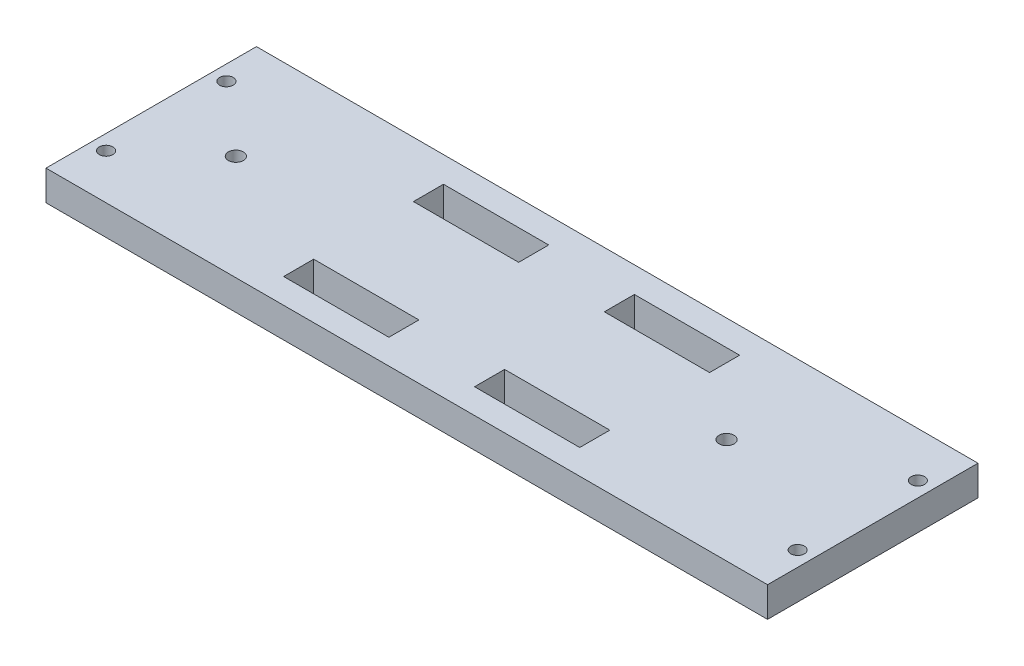
ISO-10303-21;
HEADER;
FILE_DESCRIPTION(('STEP AP214'),'2;1');
FILE_NAME('part.step','',(''),(''),'','','');
FILE_SCHEMA(('AUTOMOTIVE_DESIGN { 1 0 10303 214 1 1 1 1 }'));
ENDSEC;
DATA;
#1=APPLICATION_CONTEXT('core data for automotive mechanical design processes');
#2=APPLICATION_PROTOCOL_DEFINITION('international standard','automotive_design',2000,#1);
#3=PRODUCT_CONTEXT('',#1,'mechanical');
#4=PRODUCT('Part','Part','',(#3));
#5=PRODUCT_RELATED_PRODUCT_CATEGORY('part','',(#4));
#6=PRODUCT_DEFINITION_FORMATION('','',#4);
#7=PRODUCT_DEFINITION_CONTEXT('part definition',#1,'design');
#8=PRODUCT_DEFINITION('design','',#6,#7);
#9=PRODUCT_DEFINITION_SHAPE('','',#8);
#10=(LENGTH_UNIT() NAMED_UNIT(*) SI_UNIT(.MILLI.,.METRE.));
#11=(NAMED_UNIT(*) PLANE_ANGLE_UNIT() SI_UNIT($,.RADIAN.));
#12=(NAMED_UNIT(*) SI_UNIT($,.STERADIAN.) SOLID_ANGLE_UNIT());
#13=UNCERTAINTY_MEASURE_WITH_UNIT(LENGTH_MEASURE(1.E-05),#10,'distance_accuracy_value','');
#14=(GEOMETRIC_REPRESENTATION_CONTEXT(3) GLOBAL_UNCERTAINTY_ASSIGNED_CONTEXT((#13)) GLOBAL_UNIT_ASSIGNED_CONTEXT((#10,
#11,#12)) REPRESENTATION_CONTEXT('',''));
#15=CARTESIAN_POINT('',(0.,0.,0.));
#16=DIRECTION('',(0.,0.,1.));
#17=DIRECTION('',(1.,0.,0.));
#18=AXIS2_PLACEMENT_3D('',#15,#16,#17);
#19=CARTESIAN_POINT('',(120.,5.,35.));
#20=DIRECTION('',(-1.,0.,0.));
#21=DIRECTION('',(0.,0.,1.));
#22=AXIS2_PLACEMENT_3D('',#19,#20,#21);
#23=PLANE('',#22);
#24=DIRECTION('',(0.,0.,-1.));
#25=VECTOR('',#24,1.);
#26=CARTESIAN_POINT('',(120.,-5.,35.));
#27=LINE('',#26,#25);
#28=CARTESIAN_POINT('',(120.,-5.,35.));
#29=VERTEX_POINT('',#28);
#30=CARTESIAN_POINT('',(120.,-5.,-35.));
#31=VERTEX_POINT('',#30);
#32=EDGE_CURVE('E329',#29,#31,#27,.T.);
#33=ORIENTED_EDGE('',*,*,#32,.T.);
#34=DIRECTION('',(0.,-1.,0.));
#35=VECTOR('',#34,1.);
#36=CARTESIAN_POINT('',(120.,5.,-35.));
#37=LINE('',#36,#35);
#38=CARTESIAN_POINT('',(120.,5.,-35.));
#39=VERTEX_POINT('',#38);
#40=EDGE_CURVE('E11',#39,#31,#37,.T.);
#41=ORIENTED_EDGE('',*,*,#40,.F.);
#42=DIRECTION('',(0.,0.,-1.));
#43=VECTOR('',#42,1.);
#44=CARTESIAN_POINT('',(120.,5.,35.));
#45=LINE('',#44,#43);
#46=CARTESIAN_POINT('',(120.,5.,35.));
#47=VERTEX_POINT('',#46);
#48=EDGE_CURVE('E332',#47,#39,#45,.T.);
#49=ORIENTED_EDGE('',*,*,#48,.F.);
#50=DIRECTION('',(0.,-1.,0.));
#51=VECTOR('',#50,1.);
#52=CARTESIAN_POINT('',(120.,5.,35.));
#53=LINE('',#52,#51);
#54=EDGE_CURVE('E342',#47,#29,#53,.T.);
#55=ORIENTED_EDGE('',*,*,#54,.T.);
#56=EDGE_LOOP('',(#33,#41,#49,#55));
#57=FACE_BOUND('',#56,.T.);
#58=ADVANCED_FACE('F39',(#57),#23,.F.);
#59=CARTESIAN_POINT('',(-120.,5.,-35.));
#60=DIRECTION('',(0.,0.,1.));
#61=DIRECTION('',(1.,0.,0.));
#62=AXIS2_PLACEMENT_3D('',#59,#60,#61);
#63=PLANE('',#62);
#64=DIRECTION('',(-1.,0.,0.));
#65=VECTOR('',#64,1.);
#66=CARTESIAN_POINT('',(-120.,-5.,-35.));
#67=LINE('',#66,#65);
#68=CARTESIAN_POINT('',(-120.,-5.,-35.));
#69=VERTEX_POINT('',#68);
#70=EDGE_CURVE('E345',#31,#69,#67,.T.);
#71=ORIENTED_EDGE('',*,*,#70,.T.);
#72=DIRECTION('',(0.,-1.,0.));
#73=VECTOR('',#72,1.);
#74=CARTESIAN_POINT('',(-120.,5.,-35.));
#75=LINE('',#74,#73);
#76=CARTESIAN_POINT('',(-120.,5.,-35.));
#77=VERTEX_POINT('',#76);
#78=EDGE_CURVE('E46',#77,#69,#75,.T.);
#79=ORIENTED_EDGE('',*,*,#78,.F.);
#80=DIRECTION('',(-1.,0.,0.));
#81=VECTOR('',#80,1.);
#82=CARTESIAN_POINT('',(-120.,5.,-35.));
#83=LINE('',#82,#81);
#84=EDGE_CURVE('E335',#39,#77,#83,.T.);
#85=ORIENTED_EDGE('',*,*,#84,.F.);
#86=ORIENTED_EDGE('',*,*,#40,.T.);
#87=EDGE_LOOP('',(#71,#79,#85,#86));
#88=FACE_BOUND('',#87,.T.);
#89=ADVANCED_FACE('F374',(#88),#63,.F.);
#90=CARTESIAN_POINT('',(-120.,5.,35.));
#91=DIRECTION('',(1.,0.,0.));
#92=DIRECTION('',(0.,0.,-1.));
#93=AXIS2_PLACEMENT_3D('',#90,#91,#92);
#94=PLANE('',#93);
#95=DIRECTION('',(0.,0.,1.));
#96=VECTOR('',#95,1.);
#97=CARTESIAN_POINT('',(-120.,-5.,35.));
#98=LINE('',#97,#96);
#99=CARTESIAN_POINT('',(-120.,-5.,35.));
#100=VERTEX_POINT('',#99);
#101=EDGE_CURVE('E347',#69,#100,#98,.T.);
#102=ORIENTED_EDGE('',*,*,#101,.T.);
#103=DIRECTION('',(0.,-1.,0.));
#104=VECTOR('',#103,1.);
#105=CARTESIAN_POINT('',(-120.,5.,35.));
#106=LINE('',#105,#104);
#107=CARTESIAN_POINT('',(-120.,5.,35.));
#108=VERTEX_POINT('',#107);
#109=EDGE_CURVE('E352',#108,#100,#106,.T.);
#110=ORIENTED_EDGE('',*,*,#109,.F.);
#111=DIRECTION('',(0.,0.,1.));
#112=VECTOR('',#111,1.);
#113=CARTESIAN_POINT('',(-120.,5.,35.));
#114=LINE('',#113,#112);
#115=EDGE_CURVE('E338',#77,#108,#114,.T.);
#116=ORIENTED_EDGE('',*,*,#115,.F.);
#117=ORIENTED_EDGE('',*,*,#78,.T.);
#118=EDGE_LOOP('',(#102,#110,#116,#117));
#119=FACE_BOUND('',#118,.T.);
#120=ADVANCED_FACE('F359',(#119),#94,.F.);
#121=CARTESIAN_POINT('',(-120.,5.,35.));
#122=DIRECTION('',(0.,0.,-1.));
#123=DIRECTION('',(-1.,0.,0.));
#124=AXIS2_PLACEMENT_3D('',#121,#122,#123);
#125=PLANE('',#124);
#126=DIRECTION('',(1.,0.,0.));
#127=VECTOR('',#126,1.);
#128=CARTESIAN_POINT('',(-120.,-5.,35.));
#129=LINE('',#128,#127);
#130=EDGE_CURVE('E336',#100,#29,#129,.T.);
#131=ORIENTED_EDGE('',*,*,#130,.T.);
#132=ORIENTED_EDGE('',*,*,#54,.F.);
#133=DIRECTION('',(1.,0.,0.));
#134=VECTOR('',#133,1.);
#135=CARTESIAN_POINT('',(-120.,5.,35.));
#136=LINE('',#135,#134);
#137=EDGE_CURVE('E340',#108,#47,#136,.T.);
#138=ORIENTED_EDGE('',*,*,#137,.F.);
#139=ORIENTED_EDGE('',*,*,#109,.T.);
#140=EDGE_LOOP('',(#131,#132,#138,#139));
#141=FACE_BOUND('',#140,.T.);
#142=ADVANCED_FACE('F368',(#141),#125,.F.);
#143=CARTESIAN_POINT('',(0.,5.,0.));
#144=DIRECTION('',(0.,-1.,0.));
#145=DIRECTION('',(0.,0.,-1.));
#146=AXIS2_PLACEMENT_3D('',#143,#144,#145);
#147=PLANE('',#146);
#148=CARTESIAN_POINT('',(71.3800000000001,5.,0.));
#149=DIRECTION('',(0.,1.,0.));
#150=DIRECTION('',(0.,0.,1.));
#151=AXIS2_PLACEMENT_3D('',#148,#149,#150);
#152=CIRCLE('',#151,2.5);
#153=CARTESIAN_POINT('',(71.3800000000001,5.,2.5));
#154=VERTEX_POINT('',#153);
#155=EDGE_CURVE('E478',#154,#154,#152,.T.);
#156=ORIENTED_EDGE('',*,*,#155,.F.);
#157=EDGE_LOOP('',(#156));
#158=FACE_BOUND('',#157,.T.);
#159=CARTESIAN_POINT('',(-91.85,5.,0.));
#160=DIRECTION('',(0.,1.,0.));
#161=DIRECTION('',(0.,0.,1.));
#162=AXIS2_PLACEMENT_3D('',#159,#160,#161);
#163=CIRCLE('',#162,2.50000000000001);
#164=CARTESIAN_POINT('',(-91.85,5.,2.50000000000001));
#165=VERTEX_POINT('',#164);
#166=EDGE_CURVE('E479',#165,#165,#163,.T.);
#167=ORIENTED_EDGE('',*,*,#166,.F.);
#168=EDGE_LOOP('',(#167));
#169=FACE_BOUND('',#168,.T.);
#170=DIRECTION('',(-1.,0.,0.));
#171=VECTOR('',#170,1.);
#172=CARTESIAN_POINT('',(-49.2499999999999,5.,16.71));
#173=LINE('',#172,#171);
#174=CARTESIAN_POINT('',(-14.2499999999999,5.,16.71));
#175=VERTEX_POINT('',#174);
#176=CARTESIAN_POINT('',(-49.2499999999999,5.,16.71));
#177=VERTEX_POINT('',#176);
#178=EDGE_CURVE('E234',#175,#177,#173,.T.);
#179=ORIENTED_EDGE('',*,*,#178,.F.);
#180=DIRECTION('',(0.,0.,-1.));
#181=VECTOR('',#180,1.);
#182=CARTESIAN_POINT('',(-14.2499999999999,5.,26.71));
#183=LINE('',#182,#181);
#184=CARTESIAN_POINT('',(-14.2499999999999,5.,26.71));
#185=VERTEX_POINT('',#184);
#186=EDGE_CURVE('E53',#185,#175,#183,.T.);
#187=ORIENTED_EDGE('',*,*,#186,.F.);
#188=DIRECTION('',(1.,0.,0.));
#189=VECTOR('',#188,1.);
#190=CARTESIAN_POINT('',(-49.2499999999999,5.,26.71));
#191=LINE('',#190,#189);
#192=CARTESIAN_POINT('',(-49.2499999999999,5.,26.71));
#193=VERTEX_POINT('',#192);
#194=EDGE_CURVE('E227',#193,#185,#191,.T.);
#195=ORIENTED_EDGE('',*,*,#194,.F.);
#196=DIRECTION('',(0.,0.,1.));
#197=VECTOR('',#196,1.);
#198=CARTESIAN_POINT('',(-49.2499999999999,5.,26.71));
#199=LINE('',#198,#197);
#200=EDGE_CURVE('E230',#177,#193,#199,.T.);
#201=ORIENTED_EDGE('',*,*,#200,.F.);
#202=EDGE_LOOP('',(#179,#187,#195,#201));
#203=FACE_BOUND('',#202,.T.);
#204=DIRECTION('',(0.,0.,1.));
#205=VECTOR('',#204,1.);
#206=CARTESIAN_POINT('',(14.25,5.,-16.46));
#207=LINE('',#206,#205);
#208=CARTESIAN_POINT('',(14.25,5.,-26.46));
#209=VERTEX_POINT('',#208);
#210=CARTESIAN_POINT('',(14.25,5.,-16.46));
#211=VERTEX_POINT('',#210);
#212=EDGE_CURVE('E262',#209,#211,#207,.T.);
#213=ORIENTED_EDGE('',*,*,#212,.F.);
#214=DIRECTION('',(-1.,0.,0.));
#215=VECTOR('',#214,1.);
#216=CARTESIAN_POINT('',(14.25,5.,-26.46));
#217=LINE('',#216,#215);
#218=CARTESIAN_POINT('',(49.25,5.,-26.46));
#219=VERTEX_POINT('',#218);
#220=EDGE_CURVE('E61',#219,#209,#217,.T.);
#221=ORIENTED_EDGE('',*,*,#220,.F.);
#222=DIRECTION('',(0.,0.,-1.));
#223=VECTOR('',#222,1.);
#224=CARTESIAN_POINT('',(49.25,5.,-16.46));
#225=LINE('',#224,#223);
#226=CARTESIAN_POINT('',(49.25,5.,-16.46));
#227=VERTEX_POINT('',#226);
#228=EDGE_CURVE('E255',#227,#219,#225,.T.);
#229=ORIENTED_EDGE('',*,*,#228,.F.);
#230=DIRECTION('',(1.,0.,0.));
#231=VECTOR('',#230,1.);
#232=CARTESIAN_POINT('',(14.25,5.,-16.46));
#233=LINE('',#232,#231);
#234=EDGE_CURVE('E258',#211,#227,#233,.T.);
#235=ORIENTED_EDGE('',*,*,#234,.F.);
#236=EDGE_LOOP('',(#213,#221,#229,#235));
#237=FACE_BOUND('',#236,.T.);
#238=DIRECTION('',(0.,0.,1.));
#239=VECTOR('',#238,1.);
#240=CARTESIAN_POINT('',(14.2500000000001,5.,26.71));
#241=LINE('',#240,#239);
#242=CARTESIAN_POINT('',(14.2500000000001,5.,16.71));
#243=VERTEX_POINT('',#242);
#244=CARTESIAN_POINT('',(14.2500000000001,5.,26.71));
#245=VERTEX_POINT('',#244);
#246=EDGE_CURVE('E200',#243,#245,#241,.T.);
#247=ORIENTED_EDGE('',*,*,#246,.F.);
#248=DIRECTION('',(-1.,0.,0.));
#249=VECTOR('',#248,1.);
#250=CARTESIAN_POINT('',(14.2500000000001,5.,16.71));
#251=LINE('',#250,#249);
#252=CARTESIAN_POINT('',(49.2500000000001,5.,16.71));
#253=VERTEX_POINT('',#252);
#254=EDGE_CURVE('E178',#253,#243,#251,.T.);
#255=ORIENTED_EDGE('',*,*,#254,.F.);
#256=DIRECTION('',(0.,0.,-1.));
#257=VECTOR('',#256,1.);
#258=CARTESIAN_POINT('',(49.2500000000001,5.,26.71));
#259=LINE('',#258,#257);
#260=CARTESIAN_POINT('',(49.2500000000001,5.,26.71));
#261=VERTEX_POINT('',#260);
#262=EDGE_CURVE('E189',#261,#253,#259,.T.);
#263=ORIENTED_EDGE('',*,*,#262,.F.);
#264=DIRECTION('',(1.,0.,0.));
#265=VECTOR('',#264,1.);
#266=CARTESIAN_POINT('',(14.2500000000001,5.,26.71));
#267=LINE('',#266,#265);
#268=EDGE_CURVE('E194',#245,#261,#267,.T.);
#269=ORIENTED_EDGE('',*,*,#268,.F.);
#270=EDGE_LOOP('',(#247,#255,#263,#269));
#271=FACE_BOUND('',#270,.T.);
#272=DIRECTION('',(-1.,0.,0.));
#273=VECTOR('',#272,1.);
#274=CARTESIAN_POINT('',(-49.25,5.,-26.46));
#275=LINE('',#274,#273);
#276=CARTESIAN_POINT('',(-14.25,5.,-26.46));
#277=VERTEX_POINT('',#276);
#278=CARTESIAN_POINT('',(-49.25,5.,-26.46));
#279=VERTEX_POINT('',#278);
#280=EDGE_CURVE('E291',#277,#279,#275,.T.);
#281=ORIENTED_EDGE('',*,*,#280,.F.);
#282=DIRECTION('',(0.,0.,-1.));
#283=VECTOR('',#282,1.);
#284=CARTESIAN_POINT('',(-14.25,5.,-16.46));
#285=LINE('',#284,#283);
#286=CARTESIAN_POINT('',(-14.25,5.,-16.46));
#287=VERTEX_POINT('',#286);
#288=EDGE_CURVE('E238',#287,#277,#285,.T.);
#289=ORIENTED_EDGE('',*,*,#288,.F.);
#290=DIRECTION('',(1.,0.,0.));
#291=VECTOR('',#290,1.);
#292=CARTESIAN_POINT('',(-49.25,5.,-16.46));
#293=LINE('',#292,#291);
#294=CARTESIAN_POINT('',(-49.25,5.,-16.46));
#295=VERTEX_POINT('',#294);
#296=EDGE_CURVE('E280',#295,#287,#293,.T.);
#297=ORIENTED_EDGE('',*,*,#296,.F.);
#298=DIRECTION('',(0.,0.,1.));
#299=VECTOR('',#298,1.);
#300=CARTESIAN_POINT('',(-49.25,5.,-16.46));
#301=LINE('',#300,#299);
#302=EDGE_CURVE('E294',#279,#295,#301,.T.);
#303=ORIENTED_EDGE('',*,*,#302,.F.);
#304=EDGE_LOOP('',(#281,#289,#297,#303));
#305=FACE_BOUND('',#304,.T.);
#306=CARTESIAN_POINT('',(115.,5.,-20.));
#307=DIRECTION('',(0.,1.,0.));
#308=DIRECTION('',(0.,0.,-1.));
#309=AXIS2_PLACEMENT_3D('',#306,#307,#308);
#310=CIRCLE('',#309,2.25);
#311=CARTESIAN_POINT('',(115.,5.,-22.25));
#312=VERTEX_POINT('',#311);
#313=EDGE_CURVE('E321',#312,#312,#310,.T.);
#314=ORIENTED_EDGE('',*,*,#313,.F.);
#315=EDGE_LOOP('',(#314));
#316=FACE_BOUND('',#315,.T.);
#317=CARTESIAN_POINT('',(115.,5.,20.));
#318=DIRECTION('',(0.,1.,0.));
#319=DIRECTION('',(0.,0.,-1.));
#320=AXIS2_PLACEMENT_3D('',#317,#318,#319);
#321=CIRCLE('',#320,2.25);
#322=CARTESIAN_POINT('',(115.,5.,17.75));
#323=VERTEX_POINT('',#322);
#324=EDGE_CURVE('E315',#323,#323,#321,.T.);
#325=ORIENTED_EDGE('',*,*,#324,.F.);
#326=EDGE_LOOP('',(#325));
#327=FACE_BOUND('',#326,.T.);
#328=CARTESIAN_POINT('',(-115.,5.,20.));
#329=DIRECTION('',(0.,1.,0.));
#330=DIRECTION('',(0.,0.,1.));
#331=AXIS2_PLACEMENT_3D('',#328,#329,#330);
#332=CIRCLE('',#331,2.25);
#333=CARTESIAN_POINT('',(-115.,5.,22.25));
#334=VERTEX_POINT('',#333);
#335=EDGE_CURVE('E308',#334,#334,#332,.T.);
#336=ORIENTED_EDGE('',*,*,#335,.F.);
#337=EDGE_LOOP('',(#336));
#338=FACE_BOUND('',#337,.T.);
#339=CARTESIAN_POINT('',(-115.,5.,-20.));
#340=DIRECTION('',(0.,1.,0.));
#341=DIRECTION('',(0.,0.,1.));
#342=AXIS2_PLACEMENT_3D('',#339,#340,#341);
#343=CIRCLE('',#342,2.25);
#344=CARTESIAN_POINT('',(-115.,5.,-17.75));
#345=VERTEX_POINT('',#344);
#346=EDGE_CURVE('E311',#345,#345,#343,.T.);
#347=ORIENTED_EDGE('',*,*,#346,.F.);
#348=EDGE_LOOP('',(#347));
#349=FACE_BOUND('',#348,.T.);
#350=ORIENTED_EDGE('',*,*,#48,.T.);
#351=ORIENTED_EDGE('',*,*,#84,.T.);
#352=ORIENTED_EDGE('',*,*,#115,.T.);
#353=ORIENTED_EDGE('',*,*,#137,.T.);
#354=EDGE_LOOP('',(#350,#351,#352,#353));
#355=FACE_BOUND('',#354,.T.);
#356=ADVANCED_FACE('F197',(#158,#169,#203,#237,#271,#305,#316,#327,#338,#349,#355),#147,.F.);
#357=CARTESIAN_POINT('',(0.,-5.,0.));
#358=DIRECTION('',(0.,-1.,0.));
#359=DIRECTION('',(0.,0.,-1.));
#360=AXIS2_PLACEMENT_3D('',#357,#358,#359);
#361=PLANE('',#360);
#362=CARTESIAN_POINT('',(71.3800000000001,-5.,0.));
#363=DIRECTION('',(0.,1.,0.));
#364=DIRECTION('',(0.,0.,1.));
#365=AXIS2_PLACEMENT_3D('',#362,#363,#364);
#366=CIRCLE('',#365,2.5);
#367=CARTESIAN_POINT('',(71.3800000000001,-5.,2.5));
#368=VERTEX_POINT('',#367);
#369=EDGE_CURVE('E186',#368,#368,#366,.T.);
#370=ORIENTED_EDGE('',*,*,#369,.T.);
#371=EDGE_LOOP('',(#370));
#372=FACE_BOUND('',#371,.T.);
#373=CARTESIAN_POINT('',(-91.85,-5.,0.));
#374=DIRECTION('',(0.,1.,0.));
#375=DIRECTION('',(0.,0.,1.));
#376=AXIS2_PLACEMENT_3D('',#373,#374,#375);
#377=CIRCLE('',#376,2.50000000000001);
#378=CARTESIAN_POINT('',(-91.85,-5.,2.50000000000001));
#379=VERTEX_POINT('',#378);
#380=EDGE_CURVE('E483',#379,#379,#377,.T.);
#381=ORIENTED_EDGE('',*,*,#380,.T.);
#382=EDGE_LOOP('',(#381));
#383=FACE_BOUND('',#382,.T.);
#384=DIRECTION('',(0.,0.,-1.));
#385=VECTOR('',#384,1.);
#386=CARTESIAN_POINT('',(-14.2499999999999,-5.,26.71));
#387=LINE('',#386,#385);
#388=CARTESIAN_POINT('',(-14.2499999999999,-5.,26.71));
#389=VERTEX_POINT('',#388);
#390=CARTESIAN_POINT('',(-14.2499999999999,-5.,16.71));
#391=VERTEX_POINT('',#390);
#392=EDGE_CURVE('E231',#389,#391,#387,.T.);
#393=ORIENTED_EDGE('',*,*,#392,.T.);
#394=DIRECTION('',(-1.,0.,0.));
#395=VECTOR('',#394,1.);
#396=CARTESIAN_POINT('',(-49.2499999999999,-5.,16.71));
#397=LINE('',#396,#395);
#398=CARTESIAN_POINT('',(-49.2499999999999,-5.,16.71));
#399=VERTEX_POINT('',#398);
#400=EDGE_CURVE('E244',#391,#399,#397,.T.);
#401=ORIENTED_EDGE('',*,*,#400,.T.);
#402=DIRECTION('',(0.,0.,1.));
#403=VECTOR('',#402,1.);
#404=CARTESIAN_POINT('',(-49.2499999999999,-5.,26.71));
#405=LINE('',#404,#403);
#406=CARTESIAN_POINT('',(-49.2499999999999,-5.,26.71));
#407=VERTEX_POINT('',#406);
#408=EDGE_CURVE('E241',#399,#407,#405,.T.);
#409=ORIENTED_EDGE('',*,*,#408,.T.);
#410=DIRECTION('',(1.,0.,0.));
#411=VECTOR('',#410,1.);
#412=CARTESIAN_POINT('',(-49.2499999999999,-5.,26.71));
#413=LINE('',#412,#411);
#414=EDGE_CURVE('E220',#407,#389,#413,.T.);
#415=ORIENTED_EDGE('',*,*,#414,.T.);
#416=EDGE_LOOP('',(#393,#401,#409,#415));
#417=FACE_BOUND('',#416,.T.);
#418=DIRECTION('',(-1.,0.,0.));
#419=VECTOR('',#418,1.);
#420=CARTESIAN_POINT('',(14.25,-5.,-26.46));
#421=LINE('',#420,#419);
#422=CARTESIAN_POINT('',(49.25,-5.,-26.46));
#423=VERTEX_POINT('',#422);
#424=CARTESIAN_POINT('',(14.25,-5.,-26.46));
#425=VERTEX_POINT('',#424);
#426=EDGE_CURVE('E259',#423,#425,#421,.T.);
#427=ORIENTED_EDGE('',*,*,#426,.T.);
#428=DIRECTION('',(0.,0.,1.));
#429=VECTOR('',#428,1.);
#430=CARTESIAN_POINT('',(14.25,-5.,-16.46));
#431=LINE('',#430,#429);
#432=CARTESIAN_POINT('',(14.25,-5.,-16.46));
#433=VERTEX_POINT('',#432);
#434=EDGE_CURVE('E271',#425,#433,#431,.T.);
#435=ORIENTED_EDGE('',*,*,#434,.T.);
#436=DIRECTION('',(1.,0.,0.));
#437=VECTOR('',#436,1.);
#438=CARTESIAN_POINT('',(14.25,-5.,-16.46));
#439=LINE('',#438,#437);
#440=CARTESIAN_POINT('',(49.25,-5.,-16.46));
#441=VERTEX_POINT('',#440);
#442=EDGE_CURVE('E268',#433,#441,#439,.T.);
#443=ORIENTED_EDGE('',*,*,#442,.T.);
#444=DIRECTION('',(0.,0.,-1.));
#445=VECTOR('',#444,1.);
#446=CARTESIAN_POINT('',(49.25,-5.,-16.46));
#447=LINE('',#446,#445);
#448=EDGE_CURVE('E251',#441,#423,#447,.T.);
#449=ORIENTED_EDGE('',*,*,#448,.T.);
#450=EDGE_LOOP('',(#427,#435,#443,#449));
#451=FACE_BOUND('',#450,.T.);
#452=DIRECTION('',(-1.,0.,0.));
#453=VECTOR('',#452,1.);
#454=CARTESIAN_POINT('',(14.2500000000001,-5.,16.71));
#455=LINE('',#454,#453);
#456=CARTESIAN_POINT('',(49.2500000000001,-5.,16.71));
#457=VERTEX_POINT('',#456);
#458=CARTESIAN_POINT('',(14.2500000000001,-5.,16.71));
#459=VERTEX_POINT('',#458);
#460=EDGE_CURVE('E181',#457,#459,#455,.T.);
#461=ORIENTED_EDGE('',*,*,#460,.T.);
#462=DIRECTION('',(0.,0.,1.));
#463=VECTOR('',#462,1.);
#464=CARTESIAN_POINT('',(14.2500000000001,-5.,26.71));
#465=LINE('',#464,#463);
#466=CARTESIAN_POINT('',(14.2500000000001,-5.,26.71));
#467=VERTEX_POINT('',#466);
#468=EDGE_CURVE('E214',#459,#467,#465,.T.);
#469=ORIENTED_EDGE('',*,*,#468,.T.);
#470=DIRECTION('',(1.,0.,0.));
#471=VECTOR('',#470,1.);
#472=CARTESIAN_POINT('',(14.2500000000001,-5.,26.71));
#473=LINE('',#472,#471);
#474=CARTESIAN_POINT('',(49.2500000000001,-5.,26.71));
#475=VERTEX_POINT('',#474);
#476=EDGE_CURVE('E210',#467,#475,#473,.T.);
#477=ORIENTED_EDGE('',*,*,#476,.T.);
#478=DIRECTION('',(0.,0.,-1.));
#479=VECTOR('',#478,1.);
#480=CARTESIAN_POINT('',(49.2500000000001,-5.,26.71));
#481=LINE('',#480,#479);
#482=EDGE_CURVE('E208',#475,#457,#481,.T.);
#483=ORIENTED_EDGE('',*,*,#482,.T.);
#484=EDGE_LOOP('',(#461,#469,#477,#483));
#485=FACE_BOUND('',#484,.T.);
#486=DIRECTION('',(0.,0.,-1.));
#487=VECTOR('',#486,1.);
#488=CARTESIAN_POINT('',(-14.25,-5.,-16.46));
#489=LINE('',#488,#487);
#490=CARTESIAN_POINT('',(-14.25,-5.,-16.46));
#491=VERTEX_POINT('',#490);
#492=CARTESIAN_POINT('',(-14.25,-5.,-26.46));
#493=VERTEX_POINT('',#492);
#494=EDGE_CURVE('E276',#491,#493,#489,.T.);
#495=ORIENTED_EDGE('',*,*,#494,.T.);
#496=DIRECTION('',(-1.,0.,0.));
#497=VECTOR('',#496,1.);
#498=CARTESIAN_POINT('',(-49.25,-5.,-26.46));
#499=LINE('',#498,#497);
#500=CARTESIAN_POINT('',(-49.25,-5.,-26.46));
#501=VERTEX_POINT('',#500);
#502=EDGE_CURVE('E279',#493,#501,#499,.T.);
#503=ORIENTED_EDGE('',*,*,#502,.T.);
#504=DIRECTION('',(0.,0.,1.));
#505=VECTOR('',#504,1.);
#506=CARTESIAN_POINT('',(-49.25,-5.,-16.46));
#507=LINE('',#506,#505);
#508=CARTESIAN_POINT('',(-49.25,-5.,-16.46));
#509=VERTEX_POINT('',#508);
#510=EDGE_CURVE('E283',#501,#509,#507,.T.);
#511=ORIENTED_EDGE('',*,*,#510,.T.);
#512=DIRECTION('',(1.,0.,0.));
#513=VECTOR('',#512,1.);
#514=CARTESIAN_POINT('',(-49.25,-5.,-16.46));
#515=LINE('',#514,#513);
#516=EDGE_CURVE('E286',#509,#491,#515,.T.);
#517=ORIENTED_EDGE('',*,*,#516,.T.);
#518=EDGE_LOOP('',(#495,#503,#511,#517));
#519=FACE_BOUND('',#518,.T.);
#520=CARTESIAN_POINT('',(115.,-5.,-20.));
#521=DIRECTION('',(0.,1.,0.));
#522=DIRECTION('',(0.,0.,-1.));
#523=AXIS2_PLACEMENT_3D('',#520,#521,#522);
#524=CIRCLE('',#523,2.25);
#525=CARTESIAN_POINT('',(115.,-5.,-22.25));
#526=VERTEX_POINT('',#525);
#527=EDGE_CURVE('E301',#526,#526,#524,.T.);
#528=ORIENTED_EDGE('',*,*,#527,.T.);
#529=EDGE_LOOP('',(#528));
#530=FACE_BOUND('',#529,.T.);
#531=CARTESIAN_POINT('',(115.,-5.,20.));
#532=DIRECTION('',(0.,1.,0.));
#533=DIRECTION('',(0.,0.,-1.));
#534=AXIS2_PLACEMENT_3D('',#531,#532,#533);
#535=CIRCLE('',#534,2.25);
#536=CARTESIAN_POINT('',(115.,-5.,17.75));
#537=VERTEX_POINT('',#536);
#538=EDGE_CURVE('E318',#537,#537,#535,.T.);
#539=ORIENTED_EDGE('',*,*,#538,.T.);
#540=EDGE_LOOP('',(#539));
#541=FACE_BOUND('',#540,.T.);
#542=CARTESIAN_POINT('',(-115.,-5.,20.));
#543=DIRECTION('',(0.,1.,0.));
#544=DIRECTION('',(0.,0.,1.));
#545=AXIS2_PLACEMENT_3D('',#542,#543,#544);
#546=CIRCLE('',#545,2.25);
#547=CARTESIAN_POINT('',(-115.,-5.,22.25));
#548=VERTEX_POINT('',#547);
#549=EDGE_CURVE('E312',#548,#548,#546,.T.);
#550=ORIENTED_EDGE('',*,*,#549,.T.);
#551=EDGE_LOOP('',(#550));
#552=FACE_BOUND('',#551,.T.);
#553=CARTESIAN_POINT('',(-115.,-5.,-20.));
#554=DIRECTION('',(0.,1.,0.));
#555=DIRECTION('',(0.,0.,1.));
#556=AXIS2_PLACEMENT_3D('',#553,#554,#555);
#557=CIRCLE('',#556,2.25);
#558=CARTESIAN_POINT('',(-115.,-5.,-17.75));
#559=VERTEX_POINT('',#558);
#560=EDGE_CURVE('E326',#559,#559,#557,.T.);
#561=ORIENTED_EDGE('',*,*,#560,.T.);
#562=EDGE_LOOP('',(#561));
#563=FACE_BOUND('',#562,.T.);
#564=ORIENTED_EDGE('',*,*,#32,.F.);
#565=ORIENTED_EDGE('',*,*,#130,.F.);
#566=ORIENTED_EDGE('',*,*,#101,.F.);
#567=ORIENTED_EDGE('',*,*,#70,.F.);
#568=EDGE_LOOP('',(#564,#565,#566,#567));
#569=FACE_BOUND('',#568,.T.);
#570=ADVANCED_FACE('F365',(#372,#383,#417,#451,#485,#519,#530,#541,#552,#563,#569),#361,.T.);
#571=CARTESIAN_POINT('',(-115.,-5.,-20.));
#572=DIRECTION('',(0.,1.,0.));
#573=DIRECTION('',(0.,0.,1.));
#574=AXIS2_PLACEMENT_3D('',#571,#572,#573);
#575=CYLINDRICAL_SURFACE('',#574,2.25);
#576=ORIENTED_EDGE('',*,*,#560,.F.);
#577=EDGE_LOOP('',(#576));
#578=FACE_BOUND('',#577,.T.);
#579=ORIENTED_EDGE('',*,*,#346,.T.);
#580=EDGE_LOOP('',(#579));
#581=FACE_BOUND('',#580,.T.);
#582=ADVANCED_FACE('F386',(#578,#581),#575,.F.);
#583=CARTESIAN_POINT('',(-115.,-5.,20.));
#584=DIRECTION('',(0.,1.,0.));
#585=DIRECTION('',(0.,0.,1.));
#586=AXIS2_PLACEMENT_3D('',#583,#584,#585);
#587=CYLINDRICAL_SURFACE('',#586,2.25);
#588=ORIENTED_EDGE('',*,*,#549,.F.);
#589=EDGE_LOOP('',(#588));
#590=FACE_BOUND('',#589,.T.);
#591=ORIENTED_EDGE('',*,*,#335,.T.);
#592=EDGE_LOOP('',(#591));
#593=FACE_BOUND('',#592,.T.);
#594=ADVANCED_FACE('F393',(#590,#593),#587,.F.);
#595=CARTESIAN_POINT('',(115.,-5.,20.));
#596=DIRECTION('',(0.,1.,0.));
#597=DIRECTION('',(0.,0.,1.));
#598=AXIS2_PLACEMENT_3D('',#595,#596,#597);
#599=CYLINDRICAL_SURFACE('',#598,2.25);
#600=ORIENTED_EDGE('',*,*,#538,.F.);
#601=EDGE_LOOP('',(#600));
#602=FACE_BOUND('',#601,.T.);
#603=ORIENTED_EDGE('',*,*,#324,.T.);
#604=EDGE_LOOP('',(#603));
#605=FACE_BOUND('',#604,.T.);
#606=ADVANCED_FACE('F399',(#602,#605),#599,.F.);
#607=CARTESIAN_POINT('',(115.,-5.,-20.));
#608=DIRECTION('',(0.,1.,0.));
#609=DIRECTION('',(0.,0.,1.));
#610=AXIS2_PLACEMENT_3D('',#607,#608,#609);
#611=CYLINDRICAL_SURFACE('',#610,2.25);
#612=ORIENTED_EDGE('',*,*,#527,.F.);
#613=EDGE_LOOP('',(#612));
#614=FACE_BOUND('',#613,.T.);
#615=ORIENTED_EDGE('',*,*,#313,.T.);
#616=EDGE_LOOP('',(#615));
#617=FACE_BOUND('',#616,.T.);
#618=ADVANCED_FACE('F395',(#614,#617),#611,.F.);
#619=CARTESIAN_POINT('',(-14.25,-5.,-16.46));
#620=DIRECTION('',(1.,0.,0.));
#621=DIRECTION('',(0.,0.,-1.));
#622=AXIS2_PLACEMENT_3D('',#619,#620,#621);
#623=PLANE('',#622);
#624=ORIENTED_EDGE('',*,*,#288,.T.);
#625=DIRECTION('',(0.,1.,0.));
#626=VECTOR('',#625,1.);
#627=CARTESIAN_POINT('',(-14.25,-5.,-26.46));
#628=LINE('',#627,#626);
#629=EDGE_CURVE('E289',#493,#277,#628,.T.);
#630=ORIENTED_EDGE('',*,*,#629,.F.);
#631=ORIENTED_EDGE('',*,*,#494,.F.);
#632=DIRECTION('',(0.,1.,0.));
#633=VECTOR('',#632,1.);
#634=CARTESIAN_POINT('',(-14.25,-5.,-16.46));
#635=LINE('',#634,#633);
#636=EDGE_CURVE('E299',#491,#287,#635,.T.);
#637=ORIENTED_EDGE('',*,*,#636,.T.);
#638=EDGE_LOOP('',(#624,#630,#631,#637));
#639=FACE_BOUND('',#638,.T.);
#640=ADVANCED_FACE('F398',(#639),#623,.F.);
#641=CARTESIAN_POINT('',(-49.25,-5.,-16.46));
#642=DIRECTION('',(0.,0.,1.));
#643=DIRECTION('',(1.,0.,0.));
#644=AXIS2_PLACEMENT_3D('',#641,#642,#643);
#645=PLANE('',#644);
#646=ORIENTED_EDGE('',*,*,#296,.T.);
#647=ORIENTED_EDGE('',*,*,#636,.F.);
#648=ORIENTED_EDGE('',*,*,#516,.F.);
#649=DIRECTION('',(0.,1.,0.));
#650=VECTOR('',#649,1.);
#651=CARTESIAN_POINT('',(-49.25,-5.,-16.46));
#652=LINE('',#651,#650);
#653=EDGE_CURVE('E302',#509,#295,#652,.T.);
#654=ORIENTED_EDGE('',*,*,#653,.T.);
#655=EDGE_LOOP('',(#646,#647,#648,#654));
#656=FACE_BOUND('',#655,.T.);
#657=ADVANCED_FACE('F409',(#656),#645,.F.);
#658=CARTESIAN_POINT('',(-49.25,-5.,-16.46));
#659=DIRECTION('',(-1.,0.,0.));
#660=DIRECTION('',(0.,0.,1.));
#661=AXIS2_PLACEMENT_3D('',#658,#659,#660);
#662=PLANE('',#661);
#663=ORIENTED_EDGE('',*,*,#302,.T.);
#664=ORIENTED_EDGE('',*,*,#653,.F.);
#665=ORIENTED_EDGE('',*,*,#510,.F.);
#666=DIRECTION('',(0.,1.,0.));
#667=VECTOR('',#666,1.);
#668=CARTESIAN_POINT('',(-49.25,-5.,-26.46));
#669=LINE('',#668,#667);
#670=EDGE_CURVE('E304',#501,#279,#669,.T.);
#671=ORIENTED_EDGE('',*,*,#670,.T.);
#672=EDGE_LOOP('',(#663,#664,#665,#671));
#673=FACE_BOUND('',#672,.T.);
#674=ADVANCED_FACE('F414',(#673),#662,.F.);
#675=CARTESIAN_POINT('',(-49.25,-5.,-26.46));
#676=DIRECTION('',(0.,0.,-1.));
#677=DIRECTION('',(-1.,0.,0.));
#678=AXIS2_PLACEMENT_3D('',#675,#676,#677);
#679=PLANE('',#678);
#680=ORIENTED_EDGE('',*,*,#280,.T.);
#681=ORIENTED_EDGE('',*,*,#670,.F.);
#682=ORIENTED_EDGE('',*,*,#502,.F.);
#683=ORIENTED_EDGE('',*,*,#629,.T.);
#684=EDGE_LOOP('',(#680,#681,#682,#683));
#685=FACE_BOUND('',#684,.T.);
#686=ADVANCED_FACE('F411',(#685),#679,.F.);
#687=CARTESIAN_POINT('',(14.2500000000001,-5.,16.71));
#688=DIRECTION('',(0.,0.,-1.));
#689=DIRECTION('',(-1.,0.,0.));
#690=AXIS2_PLACEMENT_3D('',#687,#688,#689);
#691=PLANE('',#690);
#692=ORIENTED_EDGE('',*,*,#254,.T.);
#693=DIRECTION('',(0.,1.,0.));
#694=VECTOR('',#693,1.);
#695=CARTESIAN_POINT('',(14.2500000000001,-5.,16.71));
#696=LINE('',#695,#694);
#697=EDGE_CURVE('E211',#459,#243,#696,.T.);
#698=ORIENTED_EDGE('',*,*,#697,.F.);
#699=ORIENTED_EDGE('',*,*,#460,.F.);
#700=DIRECTION('',(0.,1.,0.));
#701=VECTOR('',#700,1.);
#702=CARTESIAN_POINT('',(49.2500000000001,-5.,16.71));
#703=LINE('',#702,#701);
#704=EDGE_CURVE('E174',#457,#253,#703,.T.);
#705=ORIENTED_EDGE('',*,*,#704,.T.);
#706=EDGE_LOOP('',(#692,#698,#699,#705));
#707=FACE_BOUND('',#706,.T.);
#708=ADVANCED_FACE('F176',(#707),#691,.F.);
#709=CARTESIAN_POINT('',(49.2500000000001,-5.,26.71));
#710=DIRECTION('',(1.,0.,0.));
#711=DIRECTION('',(0.,0.,-1.));
#712=AXIS2_PLACEMENT_3D('',#709,#710,#711);
#713=PLANE('',#712);
#714=ORIENTED_EDGE('',*,*,#262,.T.);
#715=ORIENTED_EDGE('',*,*,#704,.F.);
#716=ORIENTED_EDGE('',*,*,#482,.F.);
#717=DIRECTION('',(0.,1.,0.));
#718=VECTOR('',#717,1.);
#719=CARTESIAN_POINT('',(49.2500000000001,-5.,26.71));
#720=LINE('',#719,#718);
#721=EDGE_CURVE('E185',#475,#261,#720,.T.);
#722=ORIENTED_EDGE('',*,*,#721,.T.);
#723=EDGE_LOOP('',(#714,#715,#716,#722));
#724=FACE_BOUND('',#723,.T.);
#725=ADVANCED_FACE('F190',(#724),#713,.F.);
#726=CARTESIAN_POINT('',(14.2500000000001,-5.,26.71));
#727=DIRECTION('',(0.,0.,1.));
#728=DIRECTION('',(1.,0.,0.));
#729=AXIS2_PLACEMENT_3D('',#726,#727,#728);
#730=PLANE('',#729);
#731=ORIENTED_EDGE('',*,*,#268,.T.);
#732=ORIENTED_EDGE('',*,*,#721,.F.);
#733=ORIENTED_EDGE('',*,*,#476,.F.);
#734=DIRECTION('',(0.,1.,0.));
#735=VECTOR('',#734,1.);
#736=CARTESIAN_POINT('',(14.2500000000001,-5.,26.71));
#737=LINE('',#736,#735);
#738=EDGE_CURVE('E489',#467,#245,#737,.T.);
#739=ORIENTED_EDGE('',*,*,#738,.T.);
#740=EDGE_LOOP('',(#731,#732,#733,#739));
#741=FACE_BOUND('',#740,.T.);
#742=ADVANCED_FACE('F456',(#741),#730,.F.);
#743=CARTESIAN_POINT('',(14.2500000000001,-5.,26.71));
#744=DIRECTION('',(-1.,0.,0.));
#745=DIRECTION('',(0.,0.,1.));
#746=AXIS2_PLACEMENT_3D('',#743,#744,#745);
#747=PLANE('',#746);
#748=ORIENTED_EDGE('',*,*,#246,.T.);
#749=ORIENTED_EDGE('',*,*,#738,.F.);
#750=ORIENTED_EDGE('',*,*,#468,.F.);
#751=ORIENTED_EDGE('',*,*,#697,.T.);
#752=EDGE_LOOP('',(#748,#749,#750,#751));
#753=FACE_BOUND('',#752,.T.);
#754=ADVANCED_FACE('F438',(#753),#747,.F.);
#755=CARTESIAN_POINT('',(14.25,-5.,-26.46));
#756=DIRECTION('',(0.,0.,-1.));
#757=DIRECTION('',(-1.,0.,0.));
#758=AXIS2_PLACEMENT_3D('',#755,#756,#757);
#759=PLANE('',#758);
#760=ORIENTED_EDGE('',*,*,#220,.T.);
#761=DIRECTION('',(0.,1.,0.));
#762=VECTOR('',#761,1.);
#763=CARTESIAN_POINT('',(14.25,-5.,-26.46));
#764=LINE('',#763,#762);
#765=EDGE_CURVE('E249',#425,#209,#764,.T.);
#766=ORIENTED_EDGE('',*,*,#765,.F.);
#767=ORIENTED_EDGE('',*,*,#426,.F.);
#768=DIRECTION('',(0.,1.,0.));
#769=VECTOR('',#768,1.);
#770=CARTESIAN_POINT('',(49.25,-5.,-26.46));
#771=LINE('',#770,#769);
#772=EDGE_CURVE('E201',#423,#219,#771,.T.);
#773=ORIENTED_EDGE('',*,*,#772,.T.);
#774=EDGE_LOOP('',(#760,#766,#767,#773));
#775=FACE_BOUND('',#774,.T.);
#776=ADVANCED_FACE('F426',(#775),#759,.F.);
#777=CARTESIAN_POINT('',(49.25,-5.,-16.46));
#778=DIRECTION('',(1.,0.,0.));
#779=DIRECTION('',(0.,0.,-1.));
#780=AXIS2_PLACEMENT_3D('',#777,#778,#779);
#781=PLANE('',#780);
#782=ORIENTED_EDGE('',*,*,#228,.T.);
#783=ORIENTED_EDGE('',*,*,#772,.F.);
#784=ORIENTED_EDGE('',*,*,#448,.F.);
#785=DIRECTION('',(0.,1.,0.));
#786=VECTOR('',#785,1.);
#787=CARTESIAN_POINT('',(49.25,-5.,-16.46));
#788=LINE('',#787,#786);
#789=EDGE_CURVE('E203',#441,#227,#788,.T.);
#790=ORIENTED_EDGE('',*,*,#789,.T.);
#791=EDGE_LOOP('',(#782,#783,#784,#790));
#792=FACE_BOUND('',#791,.T.);
#793=ADVANCED_FACE('F422',(#792),#781,.F.);
#794=CARTESIAN_POINT('',(14.25,-5.,-16.46));
#795=DIRECTION('',(0.,0.,1.));
#796=DIRECTION('',(1.,0.,0.));
#797=AXIS2_PLACEMENT_3D('',#794,#795,#796);
#798=PLANE('',#797);
#799=ORIENTED_EDGE('',*,*,#234,.T.);
#800=ORIENTED_EDGE('',*,*,#789,.F.);
#801=ORIENTED_EDGE('',*,*,#442,.F.);
#802=DIRECTION('',(0.,1.,0.));
#803=VECTOR('',#802,1.);
#804=CARTESIAN_POINT('',(14.25,-5.,-16.46));
#805=LINE('',#804,#803);
#806=EDGE_CURVE('E252',#433,#211,#805,.T.);
#807=ORIENTED_EDGE('',*,*,#806,.T.);
#808=EDGE_LOOP('',(#799,#800,#801,#807));
#809=FACE_BOUND('',#808,.T.);
#810=ADVANCED_FACE('F425',(#809),#798,.F.);
#811=CARTESIAN_POINT('',(14.25,-5.,-16.46));
#812=DIRECTION('',(-1.,0.,0.));
#813=DIRECTION('',(0.,0.,1.));
#814=AXIS2_PLACEMENT_3D('',#811,#812,#813);
#815=PLANE('',#814);
#816=ORIENTED_EDGE('',*,*,#212,.T.);
#817=ORIENTED_EDGE('',*,*,#806,.F.);
#818=ORIENTED_EDGE('',*,*,#434,.F.);
#819=ORIENTED_EDGE('',*,*,#765,.T.);
#820=EDGE_LOOP('',(#816,#817,#818,#819));
#821=FACE_BOUND('',#820,.T.);
#822=ADVANCED_FACE('F430',(#821),#815,.F.);
#823=CARTESIAN_POINT('',(-14.2499999999999,-5.,26.71));
#824=DIRECTION('',(1.,0.,0.));
#825=DIRECTION('',(0.,0.,-1.));
#826=AXIS2_PLACEMENT_3D('',#823,#824,#825);
#827=PLANE('',#826);
#828=ORIENTED_EDGE('',*,*,#186,.T.);
#829=DIRECTION('',(0.,1.,0.));
#830=VECTOR('',#829,1.);
#831=CARTESIAN_POINT('',(-14.2499999999999,-5.,16.71));
#832=LINE('',#831,#830);
#833=EDGE_CURVE('E218',#391,#175,#832,.T.);
#834=ORIENTED_EDGE('',*,*,#833,.F.);
#835=ORIENTED_EDGE('',*,*,#392,.F.);
#836=DIRECTION('',(0.,1.,0.));
#837=VECTOR('',#836,1.);
#838=CARTESIAN_POINT('',(-14.2499999999999,-5.,26.71));
#839=LINE('',#838,#837);
#840=EDGE_CURVE('E225',#389,#185,#839,.T.);
#841=ORIENTED_EDGE('',*,*,#840,.T.);
#842=EDGE_LOOP('',(#828,#834,#835,#841));
#843=FACE_BOUND('',#842,.T.);
#844=ADVANCED_FACE('F434',(#843),#827,.F.);
#845=CARTESIAN_POINT('',(-49.2499999999999,-5.,26.71));
#846=DIRECTION('',(0.,0.,1.));
#847=DIRECTION('',(1.,0.,0.));
#848=AXIS2_PLACEMENT_3D('',#845,#846,#847);
#849=PLANE('',#848);
#850=ORIENTED_EDGE('',*,*,#194,.T.);
#851=ORIENTED_EDGE('',*,*,#840,.F.);
#852=ORIENTED_EDGE('',*,*,#414,.F.);
#853=DIRECTION('',(0.,1.,0.));
#854=VECTOR('',#853,1.);
#855=CARTESIAN_POINT('',(-49.2499999999999,-5.,26.71));
#856=LINE('',#855,#854);
#857=EDGE_CURVE('E223',#407,#193,#856,.T.);
#858=ORIENTED_EDGE('',*,*,#857,.T.);
#859=EDGE_LOOP('',(#850,#851,#852,#858));
#860=FACE_BOUND('',#859,.T.);
#861=ADVANCED_FACE('F439',(#860),#849,.F.);
#862=CARTESIAN_POINT('',(-49.2499999999999,-5.,26.71));
#863=DIRECTION('',(-1.,0.,0.));
#864=DIRECTION('',(0.,0.,1.));
#865=AXIS2_PLACEMENT_3D('',#862,#863,#864);
#866=PLANE('',#865);
#867=ORIENTED_EDGE('',*,*,#200,.T.);
#868=ORIENTED_EDGE('',*,*,#857,.F.);
#869=ORIENTED_EDGE('',*,*,#408,.F.);
#870=DIRECTION('',(0.,1.,0.));
#871=VECTOR('',#870,1.);
#872=CARTESIAN_POINT('',(-49.2499999999999,-5.,16.71));
#873=LINE('',#872,#871);
#874=EDGE_CURVE('E221',#399,#177,#873,.T.);
#875=ORIENTED_EDGE('',*,*,#874,.T.);
#876=EDGE_LOOP('',(#867,#868,#869,#875));
#877=FACE_BOUND('',#876,.T.);
#878=ADVANCED_FACE('F442',(#877),#866,.F.);
#879=CARTESIAN_POINT('',(-49.2499999999999,-5.,16.71));
#880=DIRECTION('',(0.,0.,-1.));
#881=DIRECTION('',(-1.,0.,0.));
#882=AXIS2_PLACEMENT_3D('',#879,#880,#881);
#883=PLANE('',#882);
#884=ORIENTED_EDGE('',*,*,#178,.T.);
#885=ORIENTED_EDGE('',*,*,#874,.F.);
#886=ORIENTED_EDGE('',*,*,#400,.F.);
#887=ORIENTED_EDGE('',*,*,#833,.T.);
#888=EDGE_LOOP('',(#884,#885,#886,#887));
#889=FACE_BOUND('',#888,.T.);
#890=ADVANCED_FACE('F446',(#889),#883,.F.);
#891=CARTESIAN_POINT('',(-91.85,-5.,0.));
#892=DIRECTION('',(0.,1.,0.));
#893=DIRECTION('',(0.,0.,1.));
#894=AXIS2_PLACEMENT_3D('',#891,#892,#893);
#895=CYLINDRICAL_SURFACE('',#894,2.50000000000001);
#896=ORIENTED_EDGE('',*,*,#380,.F.);
#897=EDGE_LOOP('',(#896));
#898=FACE_BOUND('',#897,.T.);
#899=ORIENTED_EDGE('',*,*,#166,.T.);
#900=EDGE_LOOP('',(#899));
#901=FACE_BOUND('',#900,.T.);
#902=ADVANCED_FACE('F450',(#898,#901),#895,.F.);
#903=CARTESIAN_POINT('',(71.3800000000001,-5.,0.));
#904=DIRECTION('',(0.,1.,0.));
#905=DIRECTION('',(0.,0.,1.));
#906=AXIS2_PLACEMENT_3D('',#903,#904,#905);
#907=CYLINDRICAL_SURFACE('',#906,2.5);
#908=ORIENTED_EDGE('',*,*,#369,.F.);
#909=EDGE_LOOP('',(#908));
#910=FACE_BOUND('',#909,.T.);
#911=ORIENTED_EDGE('',*,*,#155,.T.);
#912=EDGE_LOOP('',(#911));
#913=FACE_BOUND('',#912,.T.);
#914=ADVANCED_FACE('F467',(#910,#913),#907,.F.);
#915=CLOSED_SHELL('',(#58,#89,#120,#142,#356,#570,#582,#594,#606,#618,#640,#657,#674,#686,#708,
#725,#742,#754,#776,#793,#810,#822,#844,#861,#878,#890,#902,#914));
#916=MANIFOLD_SOLID_BREP('B2',#915);
#917=ADVANCED_BREP_SHAPE_REPRESENTATION('',(#18,#916),#14);
#918=SHAPE_DEFINITION_REPRESENTATION(#9,#917);
ENDSEC;
END-ISO-10303-21;
